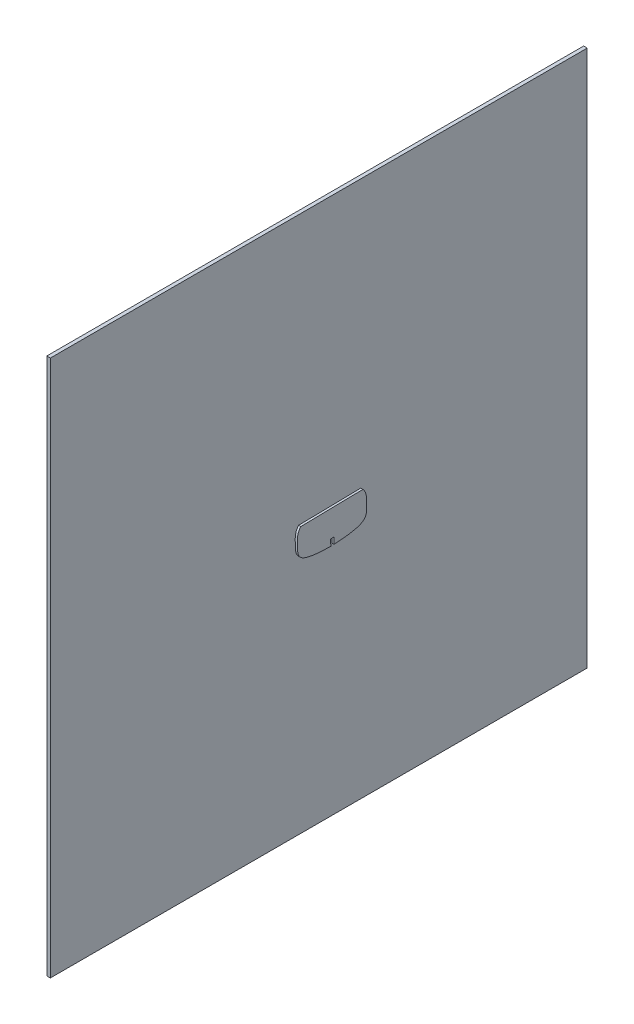
ISO-10303-21;
HEADER;
FILE_DESCRIPTION(('STEP AP214'),'2;1');
FILE_NAME('part.step','',(''),(''),'','','');
FILE_SCHEMA(('AUTOMOTIVE_DESIGN { 1 0 10303 214 1 1 1 1 }'));
ENDSEC;
DATA;
#1=APPLICATION_CONTEXT('core data for automotive mechanical design processes');
#2=APPLICATION_PROTOCOL_DEFINITION('international standard','automotive_design',2000,#1);
#3=PRODUCT_CONTEXT('',#1,'mechanical');
#4=PRODUCT('Part','Part','',(#3));
#5=PRODUCT_RELATED_PRODUCT_CATEGORY('part','',(#4));
#6=PRODUCT_DEFINITION_FORMATION('','',#4);
#7=PRODUCT_DEFINITION_CONTEXT('part definition',#1,'design');
#8=PRODUCT_DEFINITION('design','',#6,#7);
#9=PRODUCT_DEFINITION_SHAPE('','',#8);
#10=(LENGTH_UNIT() NAMED_UNIT(*) SI_UNIT(.MILLI.,.METRE.));
#11=(NAMED_UNIT(*) PLANE_ANGLE_UNIT() SI_UNIT($,.RADIAN.));
#12=(NAMED_UNIT(*) SI_UNIT($,.STERADIAN.) SOLID_ANGLE_UNIT());
#13=UNCERTAINTY_MEASURE_WITH_UNIT(LENGTH_MEASURE(1.E-05),#10,'distance_accuracy_value','');
#14=(GEOMETRIC_REPRESENTATION_CONTEXT(3) GLOBAL_UNCERTAINTY_ASSIGNED_CONTEXT((#13)) GLOBAL_UNIT_ASSIGNED_CONTEXT((#10,
#11,#12)) REPRESENTATION_CONTEXT('',''));
#15=CARTESIAN_POINT('',(0.,0.,0.));
#16=DIRECTION('',(0.,0.,1.));
#17=DIRECTION('',(1.,0.,0.));
#18=AXIS2_PLACEMENT_3D('',#15,#16,#17);
#19=CARTESIAN_POINT('',(6.,379.777747170113,93.7553459083769));
#20=CARTESIAN_POINT('',(6.,346.983836395147,120.863503041766));
#21=CARTESIAN_POINT('',(6.,325.897693231551,72.6155483454027));
#22=CARTESIAN_POINT('',(6.,291.588036558582,154.100982943705));
#23=CARTESIAN_POINT('',(6.,289.992072673944,5.25331579767635));
#24=B_SPLINE_CURVE_WITH_KNOTS('',4,(#19,#20,#21,#22,#23),.UNSPECIFIED.,.F.,.F.,(5,5),(0.,1.),.UNSPECIFIED.);
#25=DIRECTION('',(-1.,0.,0.));
#26=VECTOR('',#25,1.);
#27=SURFACE_OF_LINEAR_EXTRUSION('',#24,#26);
#28=CARTESIAN_POINT('',(0.,379.777747170113,93.7553459083769));
#29=CARTESIAN_POINT('',(0.,346.983836395147,120.863503041766));
#30=CARTESIAN_POINT('',(0.,325.897693231551,72.6155483454027));
#31=CARTESIAN_POINT('',(0.,291.588036558582,154.100982943705));
#32=CARTESIAN_POINT('',(0.,289.992072673944,5.25331579767635));
#33=B_SPLINE_CURVE_WITH_KNOTS('',4,(#28,#29,#30,#31,#32),.UNSPECIFIED.,.F.,.F.,(5,5),(0.,1.),.UNSPECIFIED.);
#34=CARTESIAN_POINT('',(0.,379.777747170113,93.7553459083769));
#35=VERTEX_POINT('',#34);
#36=CARTESIAN_POINT('',(0.,290.052771706096,9.75589213456239));
#37=VERTEX_POINT('',#36);
#38=EDGE_CURVE('E98',#35,#37,#33,.T.);
#39=ORIENTED_EDGE('',*,*,#38,.T.);
#40=DIRECTION('',(1.,0.,0.));
#41=VECTOR('',#40,1.);
#42=CARTESIAN_POINT('',(-4.,290.052771706096,9.75589213456239));
#43=LINE('',#42,#41);
#44=CARTESIAN_POINT('',(6.,290.052771706096,9.75589213456239));
#45=VERTEX_POINT('',#44);
#46=EDGE_CURVE('E103',#37,#45,#43,.T.);
#47=ORIENTED_EDGE('',*,*,#46,.T.);
#48=CARTESIAN_POINT('',(6.,379.777747170113,93.7553459083769));
#49=VERTEX_POINT('',#48);
#50=EDGE_CURVE('E92',#49,#45,#24,.T.);
#51=ORIENTED_EDGE('',*,*,#50,.F.);
#52=DIRECTION('',(-1.,0.,0.));
#53=VECTOR('',#52,1.);
#54=CARTESIAN_POINT('',(6.,379.777747170113,93.7553459083769));
#55=LINE('',#54,#53);
#56=EDGE_CURVE('E85',#49,#35,#55,.T.);
#57=ORIENTED_EDGE('',*,*,#56,.T.);
#58=EDGE_LOOP('',(#39,#47,#51,#57));
#59=FACE_BOUND('',#58,.T.);
#60=ADVANCED_FACE('F45',(#59),#27,.F.);
#61=CARTESIAN_POINT('',(6.,289.992072673944,5.25331579767635));
#62=CARTESIAN_POINT('',(6.,296.978083526584,-143.438885638387));
#63=CARTESIAN_POINT('',(6.,328.313918745232,-60.7642581893262));
#64=CARTESIAN_POINT('',(6.,351.133713235968,-108.216840261312));
#65=CARTESIAN_POINT('',(6.,382.924280537058,-79.9387109427071));
#66=B_SPLINE_CURVE_WITH_KNOTS('',4,(#61,#62,#63,#64,#65),.UNSPECIFIED.,.F.,.F.,(5,5),(0.,1.),.UNSPECIFIED.);
#67=DIRECTION('',(-1.,0.,0.));
#68=VECTOR('',#67,1.);
#69=SURFACE_OF_LINEAR_EXTRUSION('',#66,#68);
#70=CARTESIAN_POINT('',(6.,290.215810101398,0.75589213456239));
#71=VERTEX_POINT('',#70);
#72=CARTESIAN_POINT('',(6.,382.924280537058,-79.9387109427071));
#73=VERTEX_POINT('',#72);
#74=EDGE_CURVE('E143',#71,#73,#66,.T.);
#75=ORIENTED_EDGE('',*,*,#74,.F.);
#76=DIRECTION('',(1.,0.,0.));
#77=VECTOR('',#76,1.);
#78=CARTESIAN_POINT('',(-4.,290.215810101398,0.75589213456239));
#79=LINE('',#78,#77);
#80=CARTESIAN_POINT('',(0.,290.215810101398,0.75589213456239));
#81=VERTEX_POINT('',#80);
#82=EDGE_CURVE('E136',#81,#71,#79,.T.);
#83=ORIENTED_EDGE('',*,*,#82,.F.);
#84=CARTESIAN_POINT('',(0.,289.992072673944,5.25331579767635));
#85=CARTESIAN_POINT('',(0.,296.978083526584,-143.438885638387));
#86=CARTESIAN_POINT('',(0.,328.313918745232,-60.7642581893262));
#87=CARTESIAN_POINT('',(0.,351.133713235968,-108.216840261312));
#88=CARTESIAN_POINT('',(0.,382.924280537058,-79.9387109427071));
#89=B_SPLINE_CURVE_WITH_KNOTS('',4,(#84,#85,#86,#87,#88),.UNSPECIFIED.,.F.,.F.,(5,5),(0.,1.),.UNSPECIFIED.);
#90=CARTESIAN_POINT('',(0.,382.924280537058,-79.9387109427071));
#91=VERTEX_POINT('',#90);
#92=EDGE_CURVE('E93',#81,#91,#89,.T.);
#93=ORIENTED_EDGE('',*,*,#92,.T.);
#94=DIRECTION('',(-1.,0.,0.));
#95=VECTOR('',#94,1.);
#96=CARTESIAN_POINT('',(6.,382.924280537058,-79.9387109427071));
#97=LINE('',#96,#95);
#98=EDGE_CURVE('E88',#73,#91,#97,.T.);
#99=ORIENTED_EDGE('',*,*,#98,.F.);
#100=EDGE_LOOP('',(#75,#83,#93,#99));
#101=FACE_BOUND('',#100,.T.);
#102=ADVANCED_FACE('F142',(#101),#69,.F.);
#103=CARTESIAN_POINT('',(6.,379.777747170113,93.7553459083769));
#104=DIRECTION('',(0.,-0.999835956927465,-0.0181124055536427));
#105=DIRECTION('',(0.,0.0181124055536427,-0.999835956927466));
#106=AXIS2_PLACEMENT_3D('',#103,#104,#105);
#107=PLANE('',#106);
#108=DIRECTION('',(0.,-0.0181124055536427,0.999835956927466));
#109=VECTOR('',#108,1.);
#110=CARTESIAN_POINT('',(0.,379.777747170113,93.7553459083769));
#111=LINE('',#110,#109);
#112=EDGE_CURVE('E82',#91,#35,#111,.T.);
#113=ORIENTED_EDGE('',*,*,#112,.T.);
#114=ORIENTED_EDGE('',*,*,#56,.F.);
#115=DIRECTION('',(0.,-0.0181124055536427,0.999835956927466));
#116=VECTOR('',#115,1.);
#117=CARTESIAN_POINT('',(6.,379.777747170113,93.7553459083769));
#118=LINE('',#117,#116);
#119=EDGE_CURVE('E69',#73,#49,#118,.T.);
#120=ORIENTED_EDGE('',*,*,#119,.F.);
#121=ORIENTED_EDGE('',*,*,#98,.T.);
#122=EDGE_LOOP('',(#113,#114,#120,#121));
#123=FACE_BOUND('',#122,.T.);
#124=ADVANCED_FACE('F84',(#123),#107,.F.);
#125=CARTESIAN_POINT('',(6.,323.715216940518,102.159993482522));
#126=DIRECTION('',(-1.,0.,0.));
#127=DIRECTION('',(0.,0.,1.));
#128=AXIS2_PLACEMENT_3D('',#125,#126,#127);
#129=PLANE('',#128);
#130=ORIENTED_EDGE('',*,*,#50,.T.);
#131=DIRECTION('',(0.,-0.999835956927465,-0.0181124055536429));
#132=VECTOR('',#131,1.);
#133=CARTESIAN_POINT('',(6.,290.052771706096,9.75589213456239));
#134=LINE('',#133,#132);
#135=CARTESIAN_POINT('',(6.,308.052771706096,10.0819689251666));
#136=VERTEX_POINT('',#135);
#137=EDGE_CURVE('E144',#136,#45,#134,.T.);
#138=ORIENTED_EDGE('',*,*,#137,.F.);
#139=DIRECTION('',(0.,-0.0181124055536407,0.999835956927465));
#140=VECTOR('',#139,1.);
#141=CARTESIAN_POINT('',(6.,308.052771706096,10.0819689251666));
#142=LINE('',#141,#140);
#143=CARTESIAN_POINT('',(6.,308.215810101398,1.08196892516657));
#144=VERTEX_POINT('',#143);
#145=EDGE_CURVE('E148',#144,#136,#142,.T.);
#146=ORIENTED_EDGE('',*,*,#145,.F.);
#147=DIRECTION('',(0.,0.999835956927465,0.0181124055536427));
#148=VECTOR('',#147,1.);
#149=CARTESIAN_POINT('',(6.,308.215810101398,1.08196892516657));
#150=LINE('',#149,#148);
#151=EDGE_CURVE('E237',#71,#144,#150,.T.);
#152=ORIENTED_EDGE('',*,*,#151,.F.);
#153=ORIENTED_EDGE('',*,*,#74,.T.);
#154=ORIENTED_EDGE('',*,*,#119,.T.);
#155=EDGE_LOOP('',(#130,#138,#146,#152,#153,#154));
#156=FACE_BOUND('',#155,.T.);
#157=ADVANCED_FACE('F167',(#156),#129,.F.);
#158=CARTESIAN_POINT('',(0.,323.715216940518,102.159993482522));
#159=DIRECTION('',(-1.,0.,0.));
#160=DIRECTION('',(0.,0.,1.));
#161=AXIS2_PLACEMENT_3D('',#158,#159,#160);
#162=PLANE('',#161);
#163=DIRECTION('',(0.,0.999835956927465,0.0181124055536429));
#164=VECTOR('',#163,1.);
#165=CARTESIAN_POINT('',(0.,325.377559670502,10.3958139950183));
#166=LINE('',#165,#164);
#167=CARTESIAN_POINT('',(0.,308.052771706096,10.0819689251666));
#168=VERTEX_POINT('',#167);
#169=EDGE_CURVE('E13',#37,#168,#166,.T.);
#170=ORIENTED_EDGE('',*,*,#169,.F.);
#171=ORIENTED_EDGE('',*,*,#38,.F.);
#172=ORIENTED_EDGE('',*,*,#112,.F.);
#173=ORIENTED_EDGE('',*,*,#92,.F.);
#174=DIRECTION('',(0.,-0.999835956927465,-0.0181124055536427));
#175=VECTOR('',#174,1.);
#176=CARTESIAN_POINT('',(0.,325.540598065804,1.39581399501833));
#177=LINE('',#176,#175);
#178=CARTESIAN_POINT('',(0.,308.215810101398,1.08196892516658));
#179=VERTEX_POINT('',#178);
#180=EDGE_CURVE('E122',#179,#81,#177,.T.);
#181=ORIENTED_EDGE('',*,*,#180,.F.);
#182=DIRECTION('',(0.,0.0181124055536407,-0.999835956927465));
#183=VECTOR('',#182,1.);
#184=CARTESIAN_POINT('',(0.,306.390428976112,101.84614841267));
#185=LINE('',#184,#183);
#186=EDGE_CURVE('E53',#168,#179,#185,.T.);
#187=ORIENTED_EDGE('',*,*,#186,.F.);
#188=EDGE_LOOP('',(#170,#171,#172,#173,#181,#187));
#189=FACE_BOUND('',#188,.T.);
#190=ADVANCED_FACE('F101',(#189),#162,.T.);
#191=CARTESIAN_POINT('',(-4.,290.052771706096,9.75589213456239));
#192=DIRECTION('',(0.,-0.0181124055536429,0.999835956927465));
#193=DIRECTION('',(0.,-0.999835956927466,-0.0181124055536429));
#194=AXIS2_PLACEMENT_3D('',#191,#192,#193);
#195=PLANE('',#194);
#196=ORIENTED_EDGE('',*,*,#169,.T.);
#197=DIRECTION('',(1.,0.,0.));
#198=VECTOR('',#197,1.);
#199=CARTESIAN_POINT('',(-4.,308.052771706096,10.0819689251666));
#200=LINE('',#199,#198);
#201=EDGE_CURVE('E106',#168,#136,#200,.T.);
#202=ORIENTED_EDGE('',*,*,#201,.T.);
#203=ORIENTED_EDGE('',*,*,#137,.T.);
#204=ORIENTED_EDGE('',*,*,#46,.F.);
#205=EDGE_LOOP('',(#196,#202,#203,#204));
#206=FACE_BOUND('',#205,.T.);
#207=ADVANCED_FACE('F170',(#206),#195,.F.);
#208=CARTESIAN_POINT('',(-4.,308.052771706096,10.0819689251666));
#209=DIRECTION('',(0.,0.999835956927465,0.0181124055536407));
#210=DIRECTION('',(0.,-0.0181124055536407,0.999835956927466));
#211=AXIS2_PLACEMENT_3D('',#208,#209,#210);
#212=PLANE('',#211);
#213=ORIENTED_EDGE('',*,*,#186,.T.);
#214=DIRECTION('',(1.,0.,0.));
#215=VECTOR('',#214,1.);
#216=CARTESIAN_POINT('',(-4.,308.215810101398,1.08196892516657));
#217=LINE('',#216,#215);
#218=EDGE_CURVE('E60',#179,#144,#217,.T.);
#219=ORIENTED_EDGE('',*,*,#218,.T.);
#220=ORIENTED_EDGE('',*,*,#145,.T.);
#221=ORIENTED_EDGE('',*,*,#201,.F.);
#222=EDGE_LOOP('',(#213,#219,#220,#221));
#223=FACE_BOUND('',#222,.T.);
#224=ADVANCED_FACE('F126',(#223),#212,.F.);
#225=CARTESIAN_POINT('',(-4.,308.215810101398,1.08196892516657));
#226=DIRECTION('',(0.,0.0181124055536427,-0.999835956927465));
#227=DIRECTION('',(0.,0.999835956927466,0.0181124055536427));
#228=AXIS2_PLACEMENT_3D('',#225,#226,#227);
#229=PLANE('',#228);
#230=ORIENTED_EDGE('',*,*,#180,.T.);
#231=ORIENTED_EDGE('',*,*,#82,.T.);
#232=ORIENTED_EDGE('',*,*,#151,.T.);
#233=ORIENTED_EDGE('',*,*,#218,.F.);
#234=EDGE_LOOP('',(#230,#231,#232,#233));
#235=FACE_BOUND('',#234,.T.);
#236=ADVANCED_FACE('F134',(#235),#229,.F.);
#237=CLOSED_SHELL('',(#60,#102,#124,#157,#190,#207,#224,#236));
#238=MANIFOLD_SOLID_BREP('B2',#237);
#239=CARTESIAN_POINT('',(-10.,0.,0.));
#240=DIRECTION('',(-1.,0.,0.));
#241=DIRECTION('',(0.,0.,1.));
#242=AXIS2_PLACEMENT_3D('',#239,#240,#241);
#243=PLANE('',#242);
#244=DIRECTION('',(0.,0.,-1.));
#245=VECTOR('',#244,1.);
#246=CARTESIAN_POINT('',(-10.,-378.710653275796,777.274991403029));
#247=LINE('',#246,#245);
#248=CARTESIAN_POINT('',(-10.,-378.710653275796,777.274991403029));
#249=VERTEX_POINT('',#248);
#250=CARTESIAN_POINT('',(-10.,-378.710653275796,-722.725008596971));
#251=VERTEX_POINT('',#250);
#252=EDGE_CURVE('E251',#249,#251,#247,.T.);
#253=ORIENTED_EDGE('',*,*,#252,.T.);
#254=DIRECTION('',(0.,-1.,0.));
#255=VECTOR('',#254,1.);
#256=CARTESIAN_POINT('',(-10.,1121.2893467242,-722.725008596971));
#257=LINE('',#256,#255);
#258=CARTESIAN_POINT('',(-10.,1121.2893467242,-722.725008596971));
#259=VERTEX_POINT('',#258);
#260=EDGE_CURVE('E285',#259,#251,#257,.T.);
#261=ORIENTED_EDGE('',*,*,#260,.F.);
#262=DIRECTION('',(0.,0.,-1.));
#263=VECTOR('',#262,1.);
#264=CARTESIAN_POINT('',(-10.,1121.2893467242,777.274991403029));
#265=LINE('',#264,#263);
#266=CARTESIAN_POINT('',(-10.,1121.2893467242,777.274991403029));
#267=VERTEX_POINT('',#266);
#268=EDGE_CURVE('E282',#267,#259,#265,.T.);
#269=ORIENTED_EDGE('',*,*,#268,.F.);
#270=DIRECTION('',(0.,-1.,0.));
#271=VECTOR('',#270,1.);
#272=CARTESIAN_POINT('',(-10.,1121.2893467242,777.274991403029));
#273=LINE('',#272,#271);
#274=EDGE_CURVE('E279',#267,#249,#273,.T.);
#275=ORIENTED_EDGE('',*,*,#274,.T.);
#276=EDGE_LOOP('',(#253,#261,#269,#275));
#277=FACE_BOUND('',#276,.T.);
#278=ADVANCED_FACE('F242',(#277),#243,.F.);
#279=CARTESIAN_POINT('',(-20.,0.,0.));
#280=DIRECTION('',(-1.,0.,0.));
#281=DIRECTION('',(0.,0.,1.));
#282=AXIS2_PLACEMENT_3D('',#279,#280,#281);
#283=PLANE('',#282);
#284=DIRECTION('',(0.,0.,-1.));
#285=VECTOR('',#284,1.);
#286=CARTESIAN_POINT('',(-20.,-378.710653275796,777.274991403029));
#287=LINE('',#286,#285);
#288=CARTESIAN_POINT('',(-20.,-378.710653275796,777.274991403029));
#289=VERTEX_POINT('',#288);
#290=CARTESIAN_POINT('',(-20.,-378.710653275796,-722.725008596971));
#291=VERTEX_POINT('',#290);
#292=EDGE_CURVE('E43',#289,#291,#287,.T.);
#293=ORIENTED_EDGE('',*,*,#292,.F.);
#294=DIRECTION('',(0.,-1.,0.));
#295=VECTOR('',#294,1.);
#296=CARTESIAN_POINT('',(-20.,1121.2893467242,777.274991403029));
#297=LINE('',#296,#295);
#298=CARTESIAN_POINT('',(-20.,1121.2893467242,777.274991403029));
#299=VERTEX_POINT('',#298);
#300=EDGE_CURVE('E298',#299,#289,#297,.T.);
#301=ORIENTED_EDGE('',*,*,#300,.F.);
#302=DIRECTION('',(0.,0.,-1.));
#303=VECTOR('',#302,1.);
#304=CARTESIAN_POINT('',(-20.,1121.2893467242,777.274991403029));
#305=LINE('',#304,#303);
#306=CARTESIAN_POINT('',(-20.,1121.2893467242,-722.725008596971));
#307=VERTEX_POINT('',#306);
#308=EDGE_CURVE('E289',#299,#307,#305,.T.);
#309=ORIENTED_EDGE('',*,*,#308,.T.);
#310=DIRECTION('',(0.,-1.,0.));
#311=VECTOR('',#310,1.);
#312=CARTESIAN_POINT('',(-20.,1121.2893467242,-722.725008596971));
#313=LINE('',#312,#311);
#314=EDGE_CURVE('E260',#307,#291,#313,.T.);
#315=ORIENTED_EDGE('',*,*,#314,.T.);
#316=EDGE_LOOP('',(#293,#301,#309,#315));
#317=FACE_BOUND('',#316,.T.);
#318=ADVANCED_FACE('F338',(#317),#283,.T.);
#319=CARTESIAN_POINT('',(-20.,1121.2893467242,777.274991403029));
#320=DIRECTION('',(0.,0.,1.));
#321=DIRECTION('',(1.,0.,0.));
#322=AXIS2_PLACEMENT_3D('',#319,#320,#321);
#323=PLANE('',#322);
#324=ORIENTED_EDGE('',*,*,#274,.F.);
#325=DIRECTION('',(1.,0.,0.));
#326=VECTOR('',#325,1.);
#327=CARTESIAN_POINT('',(-20.,1121.2893467242,777.274991403029));
#328=LINE('',#327,#326);
#329=EDGE_CURVE('E294',#299,#267,#328,.T.);
#330=ORIENTED_EDGE('',*,*,#329,.F.);
#331=ORIENTED_EDGE('',*,*,#300,.T.);
#332=DIRECTION('',(1.,0.,0.));
#333=VECTOR('',#332,1.);
#334=CARTESIAN_POINT('',(-20.,-378.710653275796,777.274991403029));
#335=LINE('',#334,#333);
#336=EDGE_CURVE('E290',#289,#249,#335,.T.);
#337=ORIENTED_EDGE('',*,*,#336,.T.);
#338=EDGE_LOOP('',(#324,#330,#331,#337));
#339=FACE_BOUND('',#338,.T.);
#340=ADVANCED_FACE('F299',(#339),#323,.T.);
#341=CARTESIAN_POINT('',(-20.,-378.710653275796,777.274991403029));
#342=DIRECTION('',(0.,-1.,0.));
#343=DIRECTION('',(0.,0.,-1.));
#344=AXIS2_PLACEMENT_3D('',#341,#342,#343);
#345=PLANE('',#344);
#346=ORIENTED_EDGE('',*,*,#252,.F.);
#347=ORIENTED_EDGE('',*,*,#336,.F.);
#348=ORIENTED_EDGE('',*,*,#292,.T.);
#349=DIRECTION('',(1.,0.,0.));
#350=VECTOR('',#349,1.);
#351=CARTESIAN_POINT('',(-20.,-378.710653275796,-722.725008596971));
#352=LINE('',#351,#350);
#353=EDGE_CURVE('E310',#291,#251,#352,.T.);
#354=ORIENTED_EDGE('',*,*,#353,.T.);
#355=EDGE_LOOP('',(#346,#347,#348,#354));
#356=FACE_BOUND('',#355,.T.);
#357=ADVANCED_FACE('F340',(#356),#345,.T.);
#358=CARTESIAN_POINT('',(-20.,1121.2893467242,777.274991403029));
#359=DIRECTION('',(0.,-1.,0.));
#360=DIRECTION('',(0.,0.,-1.));
#361=AXIS2_PLACEMENT_3D('',#358,#359,#360);
#362=PLANE('',#361);
#363=ORIENTED_EDGE('',*,*,#268,.T.);
#364=DIRECTION('',(1.,0.,0.));
#365=VECTOR('',#364,1.);
#366=CARTESIAN_POINT('',(-20.,1121.2893467242,-722.725008596971));
#367=LINE('',#366,#365);
#368=EDGE_CURVE('E314',#307,#259,#367,.T.);
#369=ORIENTED_EDGE('',*,*,#368,.F.);
#370=ORIENTED_EDGE('',*,*,#308,.F.);
#371=ORIENTED_EDGE('',*,*,#329,.T.);
#372=EDGE_LOOP('',(#363,#369,#370,#371));
#373=FACE_BOUND('',#372,.T.);
#374=ADVANCED_FACE('F295',(#373),#362,.F.);
#375=CARTESIAN_POINT('',(-20.,1121.2893467242,-722.725008596971));
#376=DIRECTION('',(0.,0.,1.));
#377=DIRECTION('',(1.,0.,0.));
#378=AXIS2_PLACEMENT_3D('',#375,#376,#377);
#379=PLANE('',#378);
#380=ORIENTED_EDGE('',*,*,#260,.T.);
#381=ORIENTED_EDGE('',*,*,#353,.F.);
#382=ORIENTED_EDGE('',*,*,#314,.F.);
#383=ORIENTED_EDGE('',*,*,#368,.T.);
#384=EDGE_LOOP('',(#380,#381,#382,#383));
#385=FACE_BOUND('',#384,.T.);
#386=ADVANCED_FACE('F325',(#385),#379,.F.);
#387=CLOSED_SHELL('',(#278,#318,#340,#357,#374,#386));
#388=MANIFOLD_SOLID_BREP('B7_NOT_SHOWN',#387);
#389=ADVANCED_BREP_SHAPE_REPRESENTATION('',(#18,#238,#388),#14);
#390=SHAPE_DEFINITION_REPRESENTATION(#9,#389);
ENDSEC;
END-ISO-10303-21;
